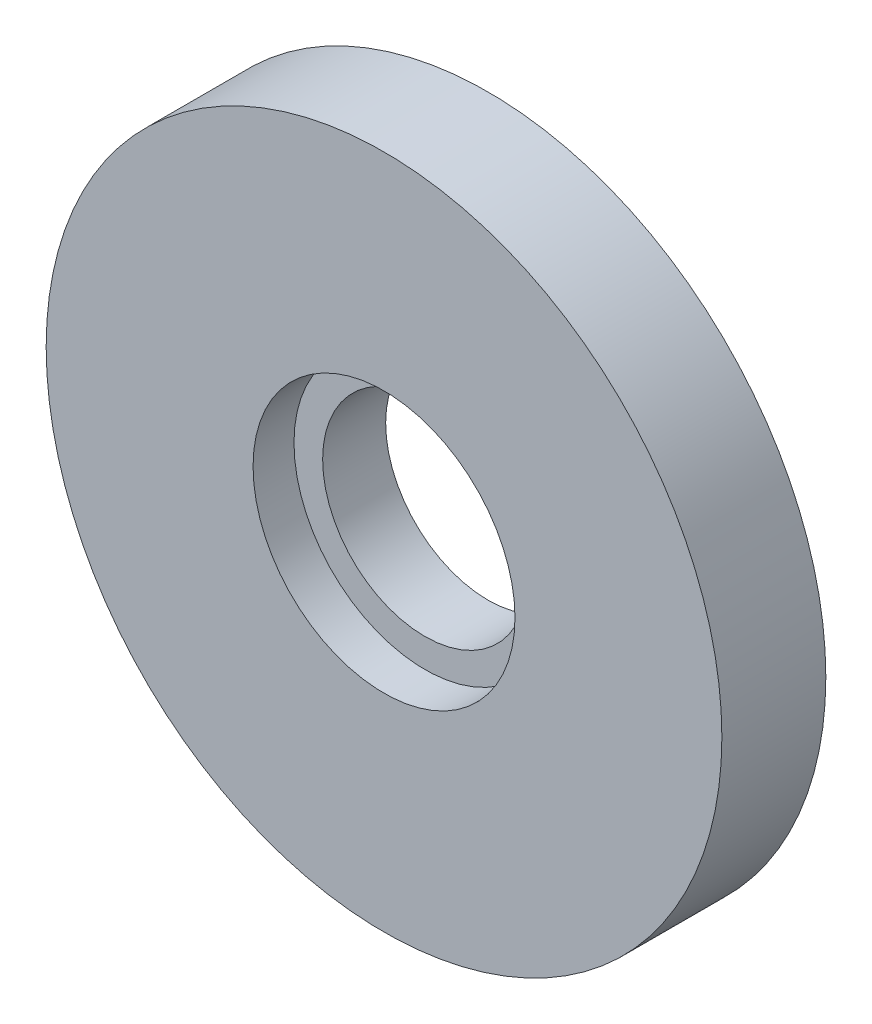
ISO-10303-21;
HEADER;
FILE_DESCRIPTION(('STEP AP214'),'2;1');
FILE_NAME('part.step','',(''),(''),'','','');
FILE_SCHEMA(('AUTOMOTIVE_DESIGN { 1 0 10303 214 1 1 1 1 }'));
ENDSEC;
DATA;
#1=APPLICATION_CONTEXT('core data for automotive mechanical design processes');
#2=APPLICATION_PROTOCOL_DEFINITION('international standard','automotive_design',2000,#1);
#3=PRODUCT_CONTEXT('',#1,'mechanical');
#4=PRODUCT('Part','Part','',(#3));
#5=PRODUCT_RELATED_PRODUCT_CATEGORY('part','',(#4));
#6=PRODUCT_DEFINITION_FORMATION('','',#4);
#7=PRODUCT_DEFINITION_CONTEXT('part definition',#1,'design');
#8=PRODUCT_DEFINITION('design','',#6,#7);
#9=PRODUCT_DEFINITION_SHAPE('','',#8);
#10=(LENGTH_UNIT() NAMED_UNIT(*) SI_UNIT(.MILLI.,.METRE.));
#11=(NAMED_UNIT(*) PLANE_ANGLE_UNIT() SI_UNIT($,.RADIAN.));
#12=(NAMED_UNIT(*) SI_UNIT($,.STERADIAN.) SOLID_ANGLE_UNIT());
#13=UNCERTAINTY_MEASURE_WITH_UNIT(LENGTH_MEASURE(1.E-05),#10,'distance_accuracy_value','');
#14=(GEOMETRIC_REPRESENTATION_CONTEXT(3) GLOBAL_UNCERTAINTY_ASSIGNED_CONTEXT((#13)) GLOBAL_UNIT_ASSIGNED_CONTEXT((#10,
#11,#12)) REPRESENTATION_CONTEXT('',''));
#15=CARTESIAN_POINT('',(0.,0.,0.));
#16=DIRECTION('',(0.,0.,1.));
#17=DIRECTION('',(1.,0.,0.));
#18=AXIS2_PLACEMENT_3D('',#15,#16,#17);
#19=CARTESIAN_POINT('',(0.,0.,-6.35));
#20=DIRECTION('',(0.,0.,1.));
#21=DIRECTION('',(1.,0.,0.));
#22=AXIS2_PLACEMENT_3D('',#19,#20,#21);
#23=CYLINDRICAL_SURFACE('',#22,12.500000019);
#24=CARTESIAN_POINT('',(0.,0.,-6.35));
#25=DIRECTION('',(0.,0.,1.));
#26=DIRECTION('',(1.,0.,0.));
#27=AXIS2_PLACEMENT_3D('',#24,#25,#26);
#28=CIRCLE('',#27,12.500000019);
#29=CARTESIAN_POINT('',(12.500000019,0.,-6.35));
#30=VERTEX_POINT('',#29);
#31=EDGE_CURVE('E52',#30,#30,#28,.T.);
#32=ORIENTED_EDGE('',*,*,#31,.F.);
#33=EDGE_LOOP('',(#32));
#34=FACE_BOUND('',#33,.T.);
#35=CARTESIAN_POINT('',(0.,0.,1.35));
#36=DIRECTION('',(0.,0.,1.));
#37=DIRECTION('',(1.,0.,0.));
#38=AXIS2_PLACEMENT_3D('',#35,#36,#37);
#39=CIRCLE('',#38,12.500000019);
#40=CARTESIAN_POINT('',(12.500000019,0.,1.35));
#41=VERTEX_POINT('',#40);
#42=EDGE_CURVE('E41',#41,#41,#39,.F.);
#43=ORIENTED_EDGE('',*,*,#42,.F.);
#44=EDGE_LOOP('',(#43));
#45=FACE_BOUND('',#44,.T.);
#46=ADVANCED_FACE('F37',(#34,#45),#23,.F.);
#47=CARTESIAN_POINT('',(0.,0.,6.35));
#48=DIRECTION('',(0.,0.,-1.));
#49=DIRECTION('',(-1.,0.,0.));
#50=AXIS2_PLACEMENT_3D('',#47,#48,#49);
#51=CYLINDRICAL_SURFACE('',#50,41.275);
#52=CARTESIAN_POINT('',(0.,0.,6.35));
#53=DIRECTION('',(0.,0.,1.));
#54=DIRECTION('',(1.,0.,0.));
#55=AXIS2_PLACEMENT_3D('',#52,#53,#54);
#56=CIRCLE('',#55,41.275);
#57=CARTESIAN_POINT('',(41.275,0.,6.35));
#58=VERTEX_POINT('',#57);
#59=EDGE_CURVE('E10',#58,#58,#56,.T.);
#60=ORIENTED_EDGE('',*,*,#59,.F.);
#61=EDGE_LOOP('',(#60));
#62=FACE_BOUND('',#61,.T.);
#63=CARTESIAN_POINT('',(0.,0.,-6.35));
#64=DIRECTION('',(0.,0.,1.));
#65=DIRECTION('',(1.,0.,0.));
#66=AXIS2_PLACEMENT_3D('',#63,#64,#65);
#67=CIRCLE('',#66,41.275);
#68=CARTESIAN_POINT('',(41.275,0.,-6.35));
#69=VERTEX_POINT('',#68);
#70=EDGE_CURVE('E46',#69,#69,#67,.T.);
#71=ORIENTED_EDGE('',*,*,#70,.T.);
#72=EDGE_LOOP('',(#71));
#73=FACE_BOUND('',#72,.T.);
#74=ADVANCED_FACE('F39',(#62,#73),#51,.T.);
#75=CARTESIAN_POINT('',(0.,0.,6.35));
#76=DIRECTION('',(0.,0.,1.));
#77=DIRECTION('',(1.,0.,0.));
#78=AXIS2_PLACEMENT_3D('',#75,#76,#77);
#79=PLANE('',#78);
#80=CARTESIAN_POINT('',(0.,0.,6.35));
#81=DIRECTION('',(0.,0.,1.));
#82=DIRECTION('',(1.,0.,0.));
#83=AXIS2_PLACEMENT_3D('',#80,#81,#82);
#84=CIRCLE('',#83,16.000000004);
#85=CARTESIAN_POINT('',(16.000000004,0.,6.35));
#86=VERTEX_POINT('',#85);
#87=EDGE_CURVE('E57',#86,#86,#84,.T.);
#88=ORIENTED_EDGE('',*,*,#87,.F.);
#89=EDGE_LOOP('',(#88));
#90=FACE_BOUND('',#89,.T.);
#91=ORIENTED_EDGE('',*,*,#59,.T.);
#92=EDGE_LOOP('',(#91));
#93=FACE_BOUND('',#92,.T.);
#94=ADVANCED_FACE('F78',(#90,#93),#79,.T.);
#95=CARTESIAN_POINT('',(0.,0.,-6.35));
#96=DIRECTION('',(0.,0.,1.));
#97=DIRECTION('',(1.,0.,0.));
#98=AXIS2_PLACEMENT_3D('',#95,#96,#97);
#99=PLANE('',#98);
#100=ORIENTED_EDGE('',*,*,#31,.T.);
#101=EDGE_LOOP('',(#100));
#102=FACE_BOUND('',#101,.T.);
#103=ORIENTED_EDGE('',*,*,#70,.F.);
#104=EDGE_LOOP('',(#103));
#105=FACE_BOUND('',#104,.T.);
#106=ADVANCED_FACE('F86',(#102,#105),#99,.F.);
#107=CARTESIAN_POINT('',(0.,0.,1.35));
#108=DIRECTION('',(0.,0.,1.));
#109=DIRECTION('',(1.,0.,0.));
#110=AXIS2_PLACEMENT_3D('',#107,#108,#109);
#111=PLANE('',#110);
#112=CARTESIAN_POINT('',(0.,0.,1.35));
#113=DIRECTION('',(0.,0.,1.));
#114=DIRECTION('',(1.,0.,0.));
#115=AXIS2_PLACEMENT_3D('',#112,#113,#114);
#116=CIRCLE('',#115,16.000000004);
#117=CARTESIAN_POINT('',(16.000000004,0.,1.35));
#118=VERTEX_POINT('',#117);
#119=EDGE_CURVE('E61',#118,#118,#116,.T.);
#120=ORIENTED_EDGE('',*,*,#119,.T.);
#121=EDGE_LOOP('',(#120));
#122=FACE_BOUND('',#121,.T.);
#123=ORIENTED_EDGE('',*,*,#42,.T.);
#124=EDGE_LOOP('',(#123));
#125=FACE_BOUND('',#124,.T.);
#126=ADVANCED_FACE('F70',(#122,#125),#111,.T.);
#127=CARTESIAN_POINT('',(0.,0.,1.35));
#128=DIRECTION('',(0.,0.,1.));
#129=DIRECTION('',(1.,0.,0.));
#130=AXIS2_PLACEMENT_3D('',#127,#128,#129);
#131=CYLINDRICAL_SURFACE('',#130,16.000000004);
#132=ORIENTED_EDGE('',*,*,#119,.F.);
#133=EDGE_LOOP('',(#132));
#134=FACE_BOUND('',#133,.T.);
#135=ORIENTED_EDGE('',*,*,#87,.T.);
#136=EDGE_LOOP('',(#135));
#137=FACE_BOUND('',#136,.T.);
#138=ADVANCED_FACE('F83',(#134,#137),#131,.F.);
#139=CLOSED_SHELL('',(#46,#74,#94,#106,#126,#138));
#140=MANIFOLD_SOLID_BREP('B2',#139);
#141=ADVANCED_BREP_SHAPE_REPRESENTATION('',(#18,#140),#14);
#142=SHAPE_DEFINITION_REPRESENTATION(#9,#141);
ENDSEC;
END-ISO-10303-21;
